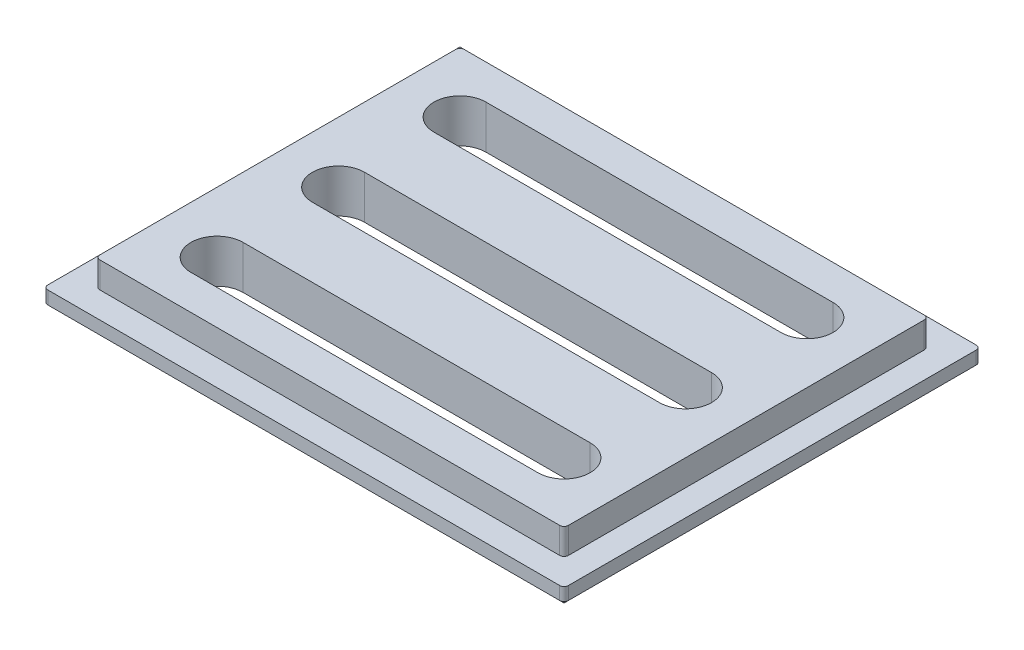
ISO-10303-21;
HEADER;
FILE_DESCRIPTION(('STEP AP214'),'2;1');
FILE_NAME('part.step','',(''),(''),'','','');
FILE_SCHEMA(('AUTOMOTIVE_DESIGN { 1 0 10303 214 1 1 1 1 }'));
ENDSEC;
DATA;
#1=APPLICATION_CONTEXT('core data for automotive mechanical design processes');
#2=APPLICATION_PROTOCOL_DEFINITION('international standard','automotive_design',2000,#1);
#3=PRODUCT_CONTEXT('',#1,'mechanical');
#4=PRODUCT('Part','Part','',(#3));
#5=PRODUCT_RELATED_PRODUCT_CATEGORY('part','',(#4));
#6=PRODUCT_DEFINITION_FORMATION('','',#4);
#7=PRODUCT_DEFINITION_CONTEXT('part definition',#1,'design');
#8=PRODUCT_DEFINITION('design','',#6,#7);
#9=PRODUCT_DEFINITION_SHAPE('','',#8);
#10=(LENGTH_UNIT() NAMED_UNIT(*) SI_UNIT(.MILLI.,.METRE.));
#11=(NAMED_UNIT(*) PLANE_ANGLE_UNIT() SI_UNIT($,.RADIAN.));
#12=(NAMED_UNIT(*) SI_UNIT($,.STERADIAN.) SOLID_ANGLE_UNIT());
#13=UNCERTAINTY_MEASURE_WITH_UNIT(LENGTH_MEASURE(1.E-05),#10,'distance_accuracy_value','');
#14=(GEOMETRIC_REPRESENTATION_CONTEXT(3) GLOBAL_UNCERTAINTY_ASSIGNED_CONTEXT((#13)) GLOBAL_UNIT_ASSIGNED_CONTEXT((#10,
#11,#12)) REPRESENTATION_CONTEXT('',''));
#15=CARTESIAN_POINT('',(0.,0.,0.));
#16=DIRECTION('',(0.,0.,1.));
#17=DIRECTION('',(1.,0.,0.));
#18=AXIS2_PLACEMENT_3D('',#15,#16,#17);
#19=CARTESIAN_POINT('',(-30.,2.,24.));
#20=DIRECTION('',(1.,0.,0.));
#21=DIRECTION('',(0.,0.,-1.));
#22=AXIS2_PLACEMENT_3D('',#19,#20,#21);
#23=PLANE('',#22);
#24=DIRECTION('',(0.,-1.,0.));
#25=VECTOR('',#24,1.);
#26=CARTESIAN_POINT('',(-30.,2.,-24.));
#27=LINE('',#26,#25);
#28=CARTESIAN_POINT('',(-30.,2.,-24.));
#29=VERTEX_POINT('',#28);
#30=CARTESIAN_POINT('',(-30.,0.499999999999994,-24.));
#31=VERTEX_POINT('',#30);
#32=EDGE_CURVE('E378',#29,#31,#27,.T.);
#33=ORIENTED_EDGE('',*,*,#32,.T.);
#34=DIRECTION('',(0.,0.,1.));
#35=VECTOR('',#34,1.);
#36=CARTESIAN_POINT('',(-30.,0.499999999999994,24.));
#37=LINE('',#36,#35);
#38=CARTESIAN_POINT('',(-30.,0.500000000000007,23.5));
#39=VERTEX_POINT('',#38);
#40=EDGE_CURVE('E451',#31,#39,#37,.T.);
#41=ORIENTED_EDGE('',*,*,#40,.T.);
#42=DIRECTION('',(0.,-1.,0.));
#43=VECTOR('',#42,1.);
#44=CARTESIAN_POINT('',(-30.,2.,23.5));
#45=LINE('',#44,#43);
#46=CARTESIAN_POINT('',(-30.,2.,23.5));
#47=VERTEX_POINT('',#46);
#48=EDGE_CURVE('E385',#39,#47,#45,.F.);
#49=ORIENTED_EDGE('',*,*,#48,.T.);
#50=DIRECTION('',(0.,0.,1.));
#51=VECTOR('',#50,1.);
#52=CARTESIAN_POINT('',(-30.,2.,24.));
#53=LINE('',#52,#51);
#54=EDGE_CURVE('E357',#29,#47,#53,.T.);
#55=ORIENTED_EDGE('',*,*,#54,.F.);
#56=EDGE_LOOP('',(#33,#41,#49,#55));
#57=FACE_BOUND('',#56,.T.);
#58=ADVANCED_FACE('F41',(#57),#23,.F.);
#59=CARTESIAN_POINT('',(30.,2.,24.));
#60=DIRECTION('',(0.,0.,-1.));
#61=DIRECTION('',(-1.,0.,0.));
#62=AXIS2_PLACEMENT_3D('',#59,#60,#61);
#63=PLANE('',#62);
#64=DIRECTION('',(0.,-1.,0.));
#65=VECTOR('',#64,1.);
#66=CARTESIAN_POINT('',(-29.5,2.,24.));
#67=LINE('',#66,#65);
#68=CARTESIAN_POINT('',(-29.5,2.,24.));
#69=VERTEX_POINT('',#68);
#70=CARTESIAN_POINT('',(-29.5,0.500000000000007,24.));
#71=VERTEX_POINT('',#70);
#72=EDGE_CURVE('E383',#69,#71,#67,.T.);
#73=ORIENTED_EDGE('',*,*,#72,.T.);
#74=DIRECTION('',(1.,0.,0.));
#75=VECTOR('',#74,1.);
#76=CARTESIAN_POINT('',(30.,0.500000000000007,24.));
#77=LINE('',#76,#75);
#78=CARTESIAN_POINT('',(29.5,0.500000000000007,24.));
#79=VERTEX_POINT('',#78);
#80=EDGE_CURVE('E11',#71,#79,#77,.T.);
#81=ORIENTED_EDGE('',*,*,#80,.T.);
#82=DIRECTION('',(0.,-1.,0.));
#83=VECTOR('',#82,1.);
#84=CARTESIAN_POINT('',(29.5,2.,24.));
#85=LINE('',#84,#83);
#86=CARTESIAN_POINT('',(29.5,2.,24.));
#87=VERTEX_POINT('',#86);
#88=EDGE_CURVE('E381',#79,#87,#85,.F.);
#89=ORIENTED_EDGE('',*,*,#88,.T.);
#90=DIRECTION('',(1.,0.,0.));
#91=VECTOR('',#90,1.);
#92=CARTESIAN_POINT('',(30.,2.,24.));
#93=LINE('',#92,#91);
#94=EDGE_CURVE('E370',#69,#87,#93,.T.);
#95=ORIENTED_EDGE('',*,*,#94,.F.);
#96=EDGE_LOOP('',(#73,#81,#89,#95));
#97=FACE_BOUND('',#96,.T.);
#98=ADVANCED_FACE('F558',(#97),#63,.F.);
#99=CARTESIAN_POINT('',(30.,2.,24.));
#100=DIRECTION('',(-1.,0.,0.));
#101=DIRECTION('',(0.,0.,1.));
#102=AXIS2_PLACEMENT_3D('',#99,#100,#101);
#103=PLANE('',#102);
#104=DIRECTION('',(0.,-1.,0.));
#105=VECTOR('',#104,1.);
#106=CARTESIAN_POINT('',(30.,2.,23.5));
#107=LINE('',#106,#105);
#108=CARTESIAN_POINT('',(30.,2.,23.5));
#109=VERTEX_POINT('',#108);
#110=CARTESIAN_POINT('',(30.,0.500000000000007,23.5));
#111=VERTEX_POINT('',#110);
#112=EDGE_CURVE('E395',#109,#111,#107,.T.);
#113=ORIENTED_EDGE('',*,*,#112,.T.);
#114=DIRECTION('',(0.,0.,-1.));
#115=VECTOR('',#114,1.);
#116=CARTESIAN_POINT('',(30.,0.499999999999994,24.));
#117=LINE('',#116,#115);
#118=CARTESIAN_POINT('',(30.,0.500000000000007,-23.5));
#119=VERTEX_POINT('',#118);
#120=EDGE_CURVE('E437',#111,#119,#117,.T.);
#121=ORIENTED_EDGE('',*,*,#120,.T.);
#122=DIRECTION('',(0.,-1.,0.));
#123=VECTOR('',#122,1.);
#124=CARTESIAN_POINT('',(30.,2.,-23.5));
#125=LINE('',#124,#123);
#126=CARTESIAN_POINT('',(30.,2.,-23.5));
#127=VERTEX_POINT('',#126);
#128=EDGE_CURVE('E393',#119,#127,#125,.F.);
#129=ORIENTED_EDGE('',*,*,#128,.T.);
#130=DIRECTION('',(0.,0.,-1.));
#131=VECTOR('',#130,1.);
#132=CARTESIAN_POINT('',(30.,2.,24.));
#133=LINE('',#132,#131);
#134=EDGE_CURVE('E373',#109,#127,#133,.T.);
#135=ORIENTED_EDGE('',*,*,#134,.F.);
#136=EDGE_LOOP('',(#113,#121,#129,#135));
#137=FACE_BOUND('',#136,.T.);
#138=ADVANCED_FACE('F495',(#137),#103,.F.);
#139=CARTESIAN_POINT('',(30.,2.,-24.));
#140=DIRECTION('',(0.,0.,1.));
#141=DIRECTION('',(1.,0.,0.));
#142=AXIS2_PLACEMENT_3D('',#139,#140,#141);
#143=PLANE('',#142);
#144=DIRECTION('',(0.,-1.,0.));
#145=VECTOR('',#144,1.);
#146=CARTESIAN_POINT('',(29.5,2.,-24.));
#147=LINE('',#146,#145);
#148=CARTESIAN_POINT('',(29.5,2.,-24.));
#149=VERTEX_POINT('',#148);
#150=CARTESIAN_POINT('',(29.5,0.500000000000007,-24.));
#151=VERTEX_POINT('',#150);
#152=EDGE_CURVE('E398',#149,#151,#147,.T.);
#153=ORIENTED_EDGE('',*,*,#152,.T.);
#154=DIRECTION('',(-1.,0.,0.));
#155=VECTOR('',#154,1.);
#156=CARTESIAN_POINT('',(30.,0.499999999999994,-24.));
#157=LINE('',#156,#155);
#158=EDGE_CURVE('E449',#151,#31,#157,.T.);
#159=ORIENTED_EDGE('',*,*,#158,.T.);
#160=ORIENTED_EDGE('',*,*,#32,.F.);
#161=DIRECTION('',(-1.,0.,0.));
#162=VECTOR('',#161,1.);
#163=CARTESIAN_POINT('',(30.,2.,-24.));
#164=LINE('',#163,#162);
#165=EDGE_CURVE('E376',#149,#29,#164,.T.);
#166=ORIENTED_EDGE('',*,*,#165,.F.);
#167=EDGE_LOOP('',(#153,#159,#160,#166));
#168=FACE_BOUND('',#167,.T.);
#169=ADVANCED_FACE('F507',(#168),#143,.F.);
#170=CARTESIAN_POINT('',(0.,2.,0.));
#171=DIRECTION('',(0.,1.,0.));
#172=DIRECTION('',(0.,0.,1.));
#173=AXIS2_PLACEMENT_3D('',#170,#171,#172);
#174=PLANE('',#173);
#175=DIRECTION('',(0.,0.,1.));
#176=VECTOR('',#175,1.);
#177=CARTESIAN_POINT('',(-27.,2.,21.));
#178=LINE('',#177,#176);
#179=CARTESIAN_POINT('',(-27.,2.,-20.5));
#180=VERTEX_POINT('',#179);
#181=CARTESIAN_POINT('',(-27.,2.,20.5));
#182=VERTEX_POINT('',#181);
#183=EDGE_CURVE('E343',#180,#182,#178,.T.);
#184=ORIENTED_EDGE('',*,*,#183,.F.);
#185=CARTESIAN_POINT('',(-26.5,2.,-20.5));
#186=DIRECTION('',(0.,1.,0.));
#187=DIRECTION('',(0.,0.,1.));
#188=AXIS2_PLACEMENT_3D('',#185,#186,#187);
#189=CIRCLE('',#188,0.5);
#190=CARTESIAN_POINT('',(-26.5,2.,-21.));
#191=VERTEX_POINT('',#190);
#192=EDGE_CURVE('E431',#180,#191,#189,.F.);
#193=ORIENTED_EDGE('',*,*,#192,.T.);
#194=DIRECTION('',(-1.,0.,0.));
#195=VECTOR('',#194,1.);
#196=CARTESIAN_POINT('',(27.,2.,-21.));
#197=LINE('',#196,#195);
#198=CARTESIAN_POINT('',(26.5,2.,-21.));
#199=VERTEX_POINT('',#198);
#200=EDGE_CURVE('E348',#199,#191,#197,.T.);
#201=ORIENTED_EDGE('',*,*,#200,.F.);
#202=CARTESIAN_POINT('',(26.5,2.,-20.5));
#203=DIRECTION('',(0.,1.,0.));
#204=DIRECTION('',(0.,0.,1.));
#205=AXIS2_PLACEMENT_3D('',#202,#203,#204);
#206=CIRCLE('',#205,0.5);
#207=CARTESIAN_POINT('',(27.,2.,-20.5));
#208=VERTEX_POINT('',#207);
#209=EDGE_CURVE('E429',#199,#208,#206,.F.);
#210=ORIENTED_EDGE('',*,*,#209,.T.);
#211=DIRECTION('',(0.,0.,-1.));
#212=VECTOR('',#211,1.);
#213=CARTESIAN_POINT('',(27.,2.,21.));
#214=LINE('',#213,#212);
#215=CARTESIAN_POINT('',(27.,2.,20.5));
#216=VERTEX_POINT('',#215);
#217=EDGE_CURVE('E363',#216,#208,#214,.T.);
#218=ORIENTED_EDGE('',*,*,#217,.F.);
#219=CARTESIAN_POINT('',(26.5,2.,20.5));
#220=DIRECTION('',(0.,1.,0.));
#221=DIRECTION('',(0.,0.,1.));
#222=AXIS2_PLACEMENT_3D('',#219,#220,#221);
#223=CIRCLE('',#222,0.5);
#224=CARTESIAN_POINT('',(26.5,2.,21.));
#225=VERTEX_POINT('',#224);
#226=EDGE_CURVE('E433',#216,#225,#223,.F.);
#227=ORIENTED_EDGE('',*,*,#226,.T.);
#228=DIRECTION('',(1.,0.,0.));
#229=VECTOR('',#228,1.);
#230=CARTESIAN_POINT('',(27.,2.,21.));
#231=LINE('',#230,#229);
#232=CARTESIAN_POINT('',(-26.5,2.,21.));
#233=VERTEX_POINT('',#232);
#234=EDGE_CURVE('E360',#233,#225,#231,.T.);
#235=ORIENTED_EDGE('',*,*,#234,.F.);
#236=CARTESIAN_POINT('',(-26.5,2.,20.5));
#237=DIRECTION('',(0.,1.,0.));
#238=DIRECTION('',(0.,0.,1.));
#239=AXIS2_PLACEMENT_3D('',#236,#237,#238);
#240=CIRCLE('',#239,0.5);
#241=EDGE_CURVE('E435',#233,#182,#240,.F.);
#242=ORIENTED_EDGE('',*,*,#241,.T.);
#243=EDGE_LOOP('',(#184,#193,#201,#210,#218,#227,#235,#242));
#244=FACE_BOUND('',#243,.T.);
#245=ORIENTED_EDGE('',*,*,#54,.T.);
#246=CARTESIAN_POINT('',(-29.5,2.,23.5));
#247=DIRECTION('',(0.,1.,0.));
#248=DIRECTION('',(0.,0.,1.));
#249=AXIS2_PLACEMENT_3D('',#246,#247,#248);
#250=CIRCLE('',#249,0.5);
#251=EDGE_CURVE('E391',#47,#69,#250,.T.);
#252=ORIENTED_EDGE('',*,*,#251,.T.);
#253=ORIENTED_EDGE('',*,*,#94,.T.);
#254=CARTESIAN_POINT('',(29.5,2.,23.5));
#255=DIRECTION('',(0.,1.,0.));
#256=DIRECTION('',(0.,0.,1.));
#257=AXIS2_PLACEMENT_3D('',#254,#255,#256);
#258=CIRCLE('',#257,0.5);
#259=EDGE_CURVE('E389',#87,#109,#258,.T.);
#260=ORIENTED_EDGE('',*,*,#259,.T.);
#261=ORIENTED_EDGE('',*,*,#134,.T.);
#262=CARTESIAN_POINT('',(29.5,2.,-23.5));
#263=DIRECTION('',(0.,1.,0.));
#264=DIRECTION('',(0.,0.,1.));
#265=AXIS2_PLACEMENT_3D('',#262,#263,#264);
#266=CIRCLE('',#265,0.5);
#267=EDGE_CURVE('E387',#127,#149,#266,.T.);
#268=ORIENTED_EDGE('',*,*,#267,.T.);
#269=ORIENTED_EDGE('',*,*,#165,.T.);
#270=EDGE_LOOP('',(#245,#252,#253,#260,#261,#268,#269));
#271=FACE_BOUND('',#270,.T.);
#272=ADVANCED_FACE('F499',(#244,#271),#174,.T.);
#273=CARTESIAN_POINT('',(0.,0.,0.));
#274=DIRECTION('',(0.,1.,0.));
#275=DIRECTION('',(0.,0.,1.));
#276=AXIS2_PLACEMENT_3D('',#273,#274,#275);
#277=PLANE('',#276);
#278=DIRECTION('',(1.,0.,0.));
#279=VECTOR('',#278,1.);
#280=CARTESIAN_POINT('',(0.,0.,-23.5));
#281=LINE('',#280,#279);
#282=CARTESIAN_POINT('',(-29.5,0.,-23.5));
#283=VERTEX_POINT('',#282);
#284=CARTESIAN_POINT('',(29.5,0.,-23.5));
#285=VERTEX_POINT('',#284);
#286=EDGE_CURVE('E444',#283,#285,#281,.T.);
#287=ORIENTED_EDGE('',*,*,#286,.T.);
#288=DIRECTION('',(0.,0.,1.));
#289=VECTOR('',#288,1.);
#290=CARTESIAN_POINT('',(29.5,0.,0.));
#291=LINE('',#290,#289);
#292=CARTESIAN_POINT('',(29.5,0.,23.5));
#293=VERTEX_POINT('',#292);
#294=EDGE_CURVE('E446',#285,#293,#291,.T.);
#295=ORIENTED_EDGE('',*,*,#294,.T.);
#296=DIRECTION('',(-1.,0.,0.));
#297=VECTOR('',#296,1.);
#298=CARTESIAN_POINT('',(0.,0.,23.5));
#299=LINE('',#298,#297);
#300=CARTESIAN_POINT('',(-29.5,0.,23.5));
#301=VERTEX_POINT('',#300);
#302=EDGE_CURVE('E440',#293,#301,#299,.T.);
#303=ORIENTED_EDGE('',*,*,#302,.T.);
#304=DIRECTION('',(0.,0.,-1.));
#305=VECTOR('',#304,1.);
#306=CARTESIAN_POINT('',(-29.5,0.,0.));
#307=LINE('',#306,#305);
#308=EDGE_CURVE('E442',#301,#283,#307,.T.);
#309=ORIENTED_EDGE('',*,*,#308,.T.);
#310=EDGE_LOOP('',(#287,#295,#303,#309));
#311=FACE_BOUND('',#310,.T.);
#312=DIRECTION('',(1.,0.,0.));
#313=VECTOR('',#312,1.);
#314=CARTESIAN_POINT('',(0.,0.,-11.));
#315=LINE('',#314,#313);
#316=CARTESIAN_POINT('',(-20.,0.,-11.));
#317=VERTEX_POINT('',#316);
#318=CARTESIAN_POINT('',(20.,0.,-11.));
#319=VERTEX_POINT('',#318);
#320=EDGE_CURVE('E337',#317,#319,#315,.T.);
#321=ORIENTED_EDGE('',*,*,#320,.T.);
#322=CARTESIAN_POINT('',(20.,0.,-14.));
#323=DIRECTION('',(0.,1.,0.));
#324=DIRECTION('',(0.,0.,1.));
#325=AXIS2_PLACEMENT_3D('',#322,#323,#324);
#326=CIRCLE('',#325,3.);
#327=CARTESIAN_POINT('',(20.,0.,-17.));
#328=VERTEX_POINT('',#327);
#329=EDGE_CURVE('E340',#319,#328,#326,.T.);
#330=ORIENTED_EDGE('',*,*,#329,.T.);
#331=DIRECTION('',(-1.,0.,0.));
#332=VECTOR('',#331,1.);
#333=CARTESIAN_POINT('',(0.,0.,-17.));
#334=LINE('',#333,#332);
#335=CARTESIAN_POINT('',(-20.,0.,-17.));
#336=VERTEX_POINT('',#335);
#337=EDGE_CURVE('E334',#328,#336,#334,.T.);
#338=ORIENTED_EDGE('',*,*,#337,.T.);
#339=CARTESIAN_POINT('',(-20.,0.,-14.));
#340=DIRECTION('',(0.,1.,0.));
#341=DIRECTION('',(0.,0.,1.));
#342=AXIS2_PLACEMENT_3D('',#339,#340,#341);
#343=CIRCLE('',#342,3.);
#344=EDGE_CURVE('E243',#336,#317,#343,.T.);
#345=ORIENTED_EDGE('',*,*,#344,.T.);
#346=EDGE_LOOP('',(#321,#330,#338,#345));
#347=FACE_BOUND('',#346,.T.);
#348=DIRECTION('',(1.,0.,0.));
#349=VECTOR('',#348,1.);
#350=CARTESIAN_POINT('',(0.,0.,3.));
#351=LINE('',#350,#349);
#352=CARTESIAN_POINT('',(-20.,0.,3.));
#353=VERTEX_POINT('',#352);
#354=CARTESIAN_POINT('',(20.,0.,3.));
#355=VERTEX_POINT('',#354);
#356=EDGE_CURVE('E328',#353,#355,#351,.T.);
#357=ORIENTED_EDGE('',*,*,#356,.T.);
#358=CARTESIAN_POINT('',(20.,0.,0.));
#359=DIRECTION('',(0.,1.,0.));
#360=DIRECTION('',(0.,0.,1.));
#361=AXIS2_PLACEMENT_3D('',#358,#359,#360);
#362=CIRCLE('',#361,3.);
#363=CARTESIAN_POINT('',(20.,0.,-3.));
#364=VERTEX_POINT('',#363);
#365=EDGE_CURVE('E331',#355,#364,#362,.T.);
#366=ORIENTED_EDGE('',*,*,#365,.T.);
#367=DIRECTION('',(-1.,0.,0.));
#368=VECTOR('',#367,1.);
#369=CARTESIAN_POINT('',(0.,0.,-3.));
#370=LINE('',#369,#368);
#371=CARTESIAN_POINT('',(-20.,0.,-3.));
#372=VERTEX_POINT('',#371);
#373=EDGE_CURVE('E322',#364,#372,#370,.T.);
#374=ORIENTED_EDGE('',*,*,#373,.T.);
#375=CARTESIAN_POINT('',(-20.,0.,0.));
#376=DIRECTION('',(0.,1.,0.));
#377=DIRECTION('',(0.,0.,1.));
#378=AXIS2_PLACEMENT_3D('',#375,#376,#377);
#379=CIRCLE('',#378,3.);
#380=EDGE_CURVE('E325',#372,#353,#379,.T.);
#381=ORIENTED_EDGE('',*,*,#380,.T.);
#382=EDGE_LOOP('',(#357,#366,#374,#381));
#383=FACE_BOUND('',#382,.T.);
#384=DIRECTION('',(1.,0.,0.));
#385=VECTOR('',#384,1.);
#386=CARTESIAN_POINT('',(0.,0.,17.));
#387=LINE('',#386,#385);
#388=CARTESIAN_POINT('',(-20.,0.,17.));
#389=VERTEX_POINT('',#388);
#390=CARTESIAN_POINT('',(20.,0.,17.));
#391=VERTEX_POINT('',#390);
#392=EDGE_CURVE('E316',#389,#391,#387,.T.);
#393=ORIENTED_EDGE('',*,*,#392,.T.);
#394=CARTESIAN_POINT('',(20.,0.,14.));
#395=DIRECTION('',(0.,1.,0.));
#396=DIRECTION('',(0.,0.,1.));
#397=AXIS2_PLACEMENT_3D('',#394,#395,#396);
#398=CIRCLE('',#397,3.);
#399=CARTESIAN_POINT('',(20.,0.,11.));
#400=VERTEX_POINT('',#399);
#401=EDGE_CURVE('E319',#391,#400,#398,.T.);
#402=ORIENTED_EDGE('',*,*,#401,.T.);
#403=DIRECTION('',(-1.,0.,0.));
#404=VECTOR('',#403,1.);
#405=CARTESIAN_POINT('',(0.,0.,11.));
#406=LINE('',#405,#404);
#407=CARTESIAN_POINT('',(-20.,0.,11.));
#408=VERTEX_POINT('',#407);
#409=EDGE_CURVE('E268',#400,#408,#406,.T.);
#410=ORIENTED_EDGE('',*,*,#409,.T.);
#411=CARTESIAN_POINT('',(-20.,0.,14.));
#412=DIRECTION('',(0.,1.,0.));
#413=DIRECTION('',(0.,0.,1.));
#414=AXIS2_PLACEMENT_3D('',#411,#412,#413);
#415=CIRCLE('',#414,3.);
#416=EDGE_CURVE('E313',#408,#389,#415,.T.);
#417=ORIENTED_EDGE('',*,*,#416,.T.);
#418=EDGE_LOOP('',(#393,#402,#410,#417));
#419=FACE_BOUND('',#418,.T.);
#420=ADVANCED_FACE('F520',(#311,#347,#383,#419),#277,.F.);
#421=CARTESIAN_POINT('',(-27.,5.,21.));
#422=DIRECTION('',(1.,0.,0.));
#423=DIRECTION('',(0.,0.,-1.));
#424=AXIS2_PLACEMENT_3D('',#421,#422,#423);
#425=PLANE('',#424);
#426=DIRECTION('',(0.,0.,1.));
#427=VECTOR('',#426,1.);
#428=CARTESIAN_POINT('',(-27.,5.,21.));
#429=LINE('',#428,#427);
#430=CARTESIAN_POINT('',(-27.,5.,-20.5));
#431=VERTEX_POINT('',#430);
#432=CARTESIAN_POINT('',(-27.,5.,20.5));
#433=VERTEX_POINT('',#432);
#434=EDGE_CURVE('E344',#431,#433,#429,.T.);
#435=ORIENTED_EDGE('',*,*,#434,.F.);
#436=DIRECTION('',(0.,-1.,0.));
#437=VECTOR('',#436,1.);
#438=CARTESIAN_POINT('',(-27.,5.,-20.5));
#439=LINE('',#438,#437);
#440=EDGE_CURVE('E421',#431,#180,#439,.T.);
#441=ORIENTED_EDGE('',*,*,#440,.T.);
#442=ORIENTED_EDGE('',*,*,#183,.T.);
#443=DIRECTION('',(0.,-1.,0.));
#444=VECTOR('',#443,1.);
#445=CARTESIAN_POINT('',(-27.,5.,20.5));
#446=LINE('',#445,#444);
#447=EDGE_CURVE('E419',#182,#433,#446,.F.);
#448=ORIENTED_EDGE('',*,*,#447,.T.);
#449=EDGE_LOOP('',(#435,#441,#442,#448));
#450=FACE_BOUND('',#449,.T.);
#451=ADVANCED_FACE('F523',(#450),#425,.F.);
#452=CARTESIAN_POINT('',(27.,5.,21.));
#453=DIRECTION('',(0.,0.,-1.));
#454=DIRECTION('',(-1.,0.,0.));
#455=AXIS2_PLACEMENT_3D('',#452,#453,#454);
#456=PLANE('',#455);
#457=ORIENTED_EDGE('',*,*,#234,.T.);
#458=DIRECTION('',(0.,-1.,0.));
#459=VECTOR('',#458,1.);
#460=CARTESIAN_POINT('',(26.5,5.,21.));
#461=LINE('',#460,#459);
#462=CARTESIAN_POINT('',(26.5,5.,21.));
#463=VERTEX_POINT('',#462);
#464=EDGE_CURVE('E427',#225,#463,#461,.F.);
#465=ORIENTED_EDGE('',*,*,#464,.T.);
#466=DIRECTION('',(1.,0.,0.));
#467=VECTOR('',#466,1.);
#468=CARTESIAN_POINT('',(27.,5.,21.));
#469=LINE('',#468,#467);
#470=CARTESIAN_POINT('',(-26.5,5.,21.));
#471=VERTEX_POINT('',#470);
#472=EDGE_CURVE('E347',#471,#463,#469,.T.);
#473=ORIENTED_EDGE('',*,*,#472,.F.);
#474=DIRECTION('',(0.,-1.,0.));
#475=VECTOR('',#474,1.);
#476=CARTESIAN_POINT('',(-26.5,5.,21.));
#477=LINE('',#476,#475);
#478=EDGE_CURVE('E424',#471,#233,#477,.T.);
#479=ORIENTED_EDGE('',*,*,#478,.T.);
#480=EDGE_LOOP('',(#457,#465,#473,#479));
#481=FACE_BOUND('',#480,.T.);
#482=ADVANCED_FACE('F688',(#481),#456,.F.);
#483=CARTESIAN_POINT('',(27.,5.,21.));
#484=DIRECTION('',(-1.,0.,0.));
#485=DIRECTION('',(0.,0.,1.));
#486=AXIS2_PLACEMENT_3D('',#483,#484,#485);
#487=PLANE('',#486);
#488=ORIENTED_EDGE('',*,*,#217,.T.);
#489=DIRECTION('',(0.,-1.,0.));
#490=VECTOR('',#489,1.);
#491=CARTESIAN_POINT('',(27.,5.,-20.5));
#492=LINE('',#491,#490);
#493=CARTESIAN_POINT('',(27.,5.,-20.5));
#494=VERTEX_POINT('',#493);
#495=EDGE_CURVE('E409',#208,#494,#492,.F.);
#496=ORIENTED_EDGE('',*,*,#495,.T.);
#497=DIRECTION('',(0.,0.,-1.));
#498=VECTOR('',#497,1.);
#499=CARTESIAN_POINT('',(27.,5.,21.));
#500=LINE('',#499,#498);
#501=CARTESIAN_POINT('',(27.,5.,20.5));
#502=VERTEX_POINT('',#501);
#503=EDGE_CURVE('E351',#502,#494,#500,.T.);
#504=ORIENTED_EDGE('',*,*,#503,.F.);
#505=DIRECTION('',(0.,-1.,0.));
#506=VECTOR('',#505,1.);
#507=CARTESIAN_POINT('',(27.,5.,20.5));
#508=LINE('',#507,#506);
#509=EDGE_CURVE('E406',#502,#216,#508,.T.);
#510=ORIENTED_EDGE('',*,*,#509,.T.);
#511=EDGE_LOOP('',(#488,#496,#504,#510));
#512=FACE_BOUND('',#511,.T.);
#513=ADVANCED_FACE('F697',(#512),#487,.F.);
#514=CARTESIAN_POINT('',(27.,5.,-21.));
#515=DIRECTION('',(0.,0.,1.));
#516=DIRECTION('',(1.,0.,0.));
#517=AXIS2_PLACEMENT_3D('',#514,#515,#516);
#518=PLANE('',#517);
#519=DIRECTION('',(-1.,0.,0.));
#520=VECTOR('',#519,1.);
#521=CARTESIAN_POINT('',(27.,5.,-21.));
#522=LINE('',#521,#520);
#523=CARTESIAN_POINT('',(26.5,5.,-21.));
#524=VERTEX_POINT('',#523);
#525=CARTESIAN_POINT('',(-26.5,5.,-21.));
#526=VERTEX_POINT('',#525);
#527=EDGE_CURVE('E354',#524,#526,#522,.T.);
#528=ORIENTED_EDGE('',*,*,#527,.F.);
#529=DIRECTION('',(0.,-1.,0.));
#530=VECTOR('',#529,1.);
#531=CARTESIAN_POINT('',(26.5,5.,-21.));
#532=LINE('',#531,#530);
#533=EDGE_CURVE('E403',#524,#199,#532,.T.);
#534=ORIENTED_EDGE('',*,*,#533,.T.);
#535=ORIENTED_EDGE('',*,*,#200,.T.);
#536=DIRECTION('',(0.,-1.,0.));
#537=VECTOR('',#536,1.);
#538=CARTESIAN_POINT('',(-26.5,5.,-21.));
#539=LINE('',#538,#537);
#540=EDGE_CURVE('E401',#191,#526,#539,.F.);
#541=ORIENTED_EDGE('',*,*,#540,.T.);
#542=EDGE_LOOP('',(#528,#534,#535,#541));
#543=FACE_BOUND('',#542,.T.);
#544=ADVANCED_FACE('F706',(#543),#518,.F.);
#545=CARTESIAN_POINT('',(0.,5.,0.));
#546=DIRECTION('',(0.,1.,0.));
#547=DIRECTION('',(0.,0.,1.));
#548=AXIS2_PLACEMENT_3D('',#545,#546,#547);
#549=PLANE('',#548);
#550=CARTESIAN_POINT('',(20.,5.,-14.));
#551=DIRECTION('',(0.,1.,0.));
#552=DIRECTION('',(0.,0.,1.));
#553=AXIS2_PLACEMENT_3D('',#550,#551,#552);
#554=CIRCLE('',#553,3.);
#555=CARTESIAN_POINT('',(20.,5.,-11.));
#556=VERTEX_POINT('',#555);
#557=CARTESIAN_POINT('',(20.,5.,-17.));
#558=VERTEX_POINT('',#557);
#559=EDGE_CURVE('E256',#556,#558,#554,.T.);
#560=ORIENTED_EDGE('',*,*,#559,.F.);
#561=DIRECTION('',(1.,0.,0.));
#562=VECTOR('',#561,1.);
#563=CARTESIAN_POINT('',(-20.,5.,-11.));
#564=LINE('',#563,#562);
#565=CARTESIAN_POINT('',(-20.,5.,-11.));
#566=VERTEX_POINT('',#565);
#567=EDGE_CURVE('E261',#566,#556,#564,.T.);
#568=ORIENTED_EDGE('',*,*,#567,.F.);
#569=CARTESIAN_POINT('',(-20.,5.,-14.));
#570=DIRECTION('',(0.,1.,0.));
#571=DIRECTION('',(0.,0.,1.));
#572=AXIS2_PLACEMENT_3D('',#569,#570,#571);
#573=CIRCLE('',#572,3.);
#574=CARTESIAN_POINT('',(-20.,5.,-17.));
#575=VERTEX_POINT('',#574);
#576=EDGE_CURVE('E240',#575,#566,#573,.T.);
#577=ORIENTED_EDGE('',*,*,#576,.F.);
#578=DIRECTION('',(-1.,0.,0.));
#579=VECTOR('',#578,1.);
#580=CARTESIAN_POINT('',(-20.,5.,-17.));
#581=LINE('',#580,#579);
#582=EDGE_CURVE('E251',#558,#575,#581,.T.);
#583=ORIENTED_EDGE('',*,*,#582,.F.);
#584=EDGE_LOOP('',(#560,#568,#577,#583));
#585=FACE_BOUND('',#584,.T.);
#586=CARTESIAN_POINT('',(20.,5.,0.));
#587=DIRECTION('',(0.,1.,0.));
#588=DIRECTION('',(0.,0.,1.));
#589=AXIS2_PLACEMENT_3D('',#586,#587,#588);
#590=CIRCLE('',#589,3.);
#591=CARTESIAN_POINT('',(20.,5.,3.));
#592=VERTEX_POINT('',#591);
#593=CARTESIAN_POINT('',(20.,5.,-3.));
#594=VERTEX_POINT('',#593);
#595=EDGE_CURVE('E290',#592,#594,#590,.T.);
#596=ORIENTED_EDGE('',*,*,#595,.F.);
#597=DIRECTION('',(1.,0.,0.));
#598=VECTOR('',#597,1.);
#599=CARTESIAN_POINT('',(-20.,5.,3.00000000000001));
#600=LINE('',#599,#598);
#601=CARTESIAN_POINT('',(-20.,5.,3.));
#602=VERTEX_POINT('',#601);
#603=EDGE_CURVE('E274',#602,#592,#600,.T.);
#604=ORIENTED_EDGE('',*,*,#603,.F.);
#605=CARTESIAN_POINT('',(-20.,5.,0.));
#606=DIRECTION('',(0.,1.,0.));
#607=DIRECTION('',(0.,0.,1.));
#608=AXIS2_PLACEMENT_3D('',#605,#606,#607);
#609=CIRCLE('',#608,3.);
#610=CARTESIAN_POINT('',(-20.,5.,-3.));
#611=VERTEX_POINT('',#610);
#612=EDGE_CURVE('E284',#611,#602,#609,.T.);
#613=ORIENTED_EDGE('',*,*,#612,.F.);
#614=DIRECTION('',(-1.,0.,0.));
#615=VECTOR('',#614,1.);
#616=CARTESIAN_POINT('',(-20.,5.,-3.));
#617=LINE('',#616,#615);
#618=EDGE_CURVE('E287',#594,#611,#617,.T.);
#619=ORIENTED_EDGE('',*,*,#618,.F.);
#620=EDGE_LOOP('',(#596,#604,#613,#619));
#621=FACE_BOUND('',#620,.T.);
#622=CARTESIAN_POINT('',(20.,5.,14.));
#623=DIRECTION('',(0.,1.,0.));
#624=DIRECTION('',(0.,0.,1.));
#625=AXIS2_PLACEMENT_3D('',#622,#623,#624);
#626=CIRCLE('',#625,3.);
#627=CARTESIAN_POINT('',(20.,5.,17.));
#628=VERTEX_POINT('',#627);
#629=CARTESIAN_POINT('',(20.,5.,11.));
#630=VERTEX_POINT('',#629);
#631=EDGE_CURVE('E281',#628,#630,#626,.T.);
#632=ORIENTED_EDGE('',*,*,#631,.F.);
#633=DIRECTION('',(1.,0.,0.));
#634=VECTOR('',#633,1.);
#635=CARTESIAN_POINT('',(-20.,5.,17.));
#636=LINE('',#635,#634);
#637=CARTESIAN_POINT('',(-20.,5.,17.));
#638=VERTEX_POINT('',#637);
#639=EDGE_CURVE('E295',#638,#628,#636,.T.);
#640=ORIENTED_EDGE('',*,*,#639,.F.);
#641=CARTESIAN_POINT('',(-20.,5.,14.));
#642=DIRECTION('',(0.,1.,0.));
#643=DIRECTION('',(0.,0.,1.));
#644=AXIS2_PLACEMENT_3D('',#641,#642,#643);
#645=CIRCLE('',#644,3.);
#646=CARTESIAN_POINT('',(-20.,5.,11.));
#647=VERTEX_POINT('',#646);
#648=EDGE_CURVE('E304',#647,#638,#645,.T.);
#649=ORIENTED_EDGE('',*,*,#648,.F.);
#650=DIRECTION('',(-1.,0.,0.));
#651=VECTOR('',#650,1.);
#652=CARTESIAN_POINT('',(-20.,5.,11.));
#653=LINE('',#652,#651);
#654=EDGE_CURVE('E307',#630,#647,#653,.T.);
#655=ORIENTED_EDGE('',*,*,#654,.F.);
#656=EDGE_LOOP('',(#632,#640,#649,#655));
#657=FACE_BOUND('',#656,.T.);
#658=ORIENTED_EDGE('',*,*,#503,.T.);
#659=CARTESIAN_POINT('',(26.5,5.,-20.5));
#660=DIRECTION('',(0.,1.,0.));
#661=DIRECTION('',(0.,0.,1.));
#662=AXIS2_PLACEMENT_3D('',#659,#660,#661);
#663=CIRCLE('',#662,0.5);
#664=EDGE_CURVE('E417',#494,#524,#663,.T.);
#665=ORIENTED_EDGE('',*,*,#664,.T.);
#666=ORIENTED_EDGE('',*,*,#527,.T.);
#667=CARTESIAN_POINT('',(-26.5,5.,-20.5));
#668=DIRECTION('',(0.,1.,0.));
#669=DIRECTION('',(0.,0.,1.));
#670=AXIS2_PLACEMENT_3D('',#667,#668,#669);
#671=CIRCLE('',#670,0.5);
#672=EDGE_CURVE('E415',#526,#431,#671,.T.);
#673=ORIENTED_EDGE('',*,*,#672,.T.);
#674=ORIENTED_EDGE('',*,*,#434,.T.);
#675=CARTESIAN_POINT('',(-26.5,5.,20.5));
#676=DIRECTION('',(0.,1.,0.));
#677=DIRECTION('',(0.,0.,1.));
#678=AXIS2_PLACEMENT_3D('',#675,#676,#677);
#679=CIRCLE('',#678,0.5);
#680=EDGE_CURVE('E411',#433,#471,#679,.T.);
#681=ORIENTED_EDGE('',*,*,#680,.T.);
#682=ORIENTED_EDGE('',*,*,#472,.T.);
#683=CARTESIAN_POINT('',(26.5,5.,20.5));
#684=DIRECTION('',(0.,1.,0.));
#685=DIRECTION('',(0.,0.,1.));
#686=AXIS2_PLACEMENT_3D('',#683,#684,#685);
#687=CIRCLE('',#686,0.5);
#688=EDGE_CURVE('E413',#463,#502,#687,.T.);
#689=ORIENTED_EDGE('',*,*,#688,.T.);
#690=EDGE_LOOP('',(#658,#665,#666,#673,#674,#681,#682,#689));
#691=FACE_BOUND('',#690,.T.);
#692=ADVANCED_FACE('F258',(#585,#621,#657,#691),#549,.T.);
#693=CARTESIAN_POINT('',(20.,-45.,14.));
#694=DIRECTION('',(0.,1.,0.));
#695=DIRECTION('',(0.,0.,1.));
#696=AXIS2_PLACEMENT_3D('',#693,#694,#695);
#697=CYLINDRICAL_SURFACE('',#696,3.);
#698=DIRECTION('',(0.,1.,0.));
#699=VECTOR('',#698,1.);
#700=CARTESIAN_POINT('',(20.,-45.,17.));
#701=LINE('',#700,#699);
#702=EDGE_CURVE('E300',#391,#628,#701,.T.);
#703=ORIENTED_EDGE('',*,*,#702,.T.);
#704=ORIENTED_EDGE('',*,*,#631,.T.);
#705=DIRECTION('',(0.,1.,0.));
#706=VECTOR('',#705,1.);
#707=CARTESIAN_POINT('',(20.,-45.,11.));
#708=LINE('',#707,#706);
#709=EDGE_CURVE('E292',#400,#630,#708,.T.);
#710=ORIENTED_EDGE('',*,*,#709,.F.);
#711=ORIENTED_EDGE('',*,*,#401,.F.);
#712=EDGE_LOOP('',(#703,#704,#710,#711));
#713=FACE_BOUND('',#712,.T.);
#714=ADVANCED_FACE('F542',(#713),#697,.F.);
#715=CARTESIAN_POINT('',(-20.,-45.,17.));
#716=DIRECTION('',(0.,0.,1.));
#717=DIRECTION('',(1.,0.,0.));
#718=AXIS2_PLACEMENT_3D('',#715,#716,#717);
#719=PLANE('',#718);
#720=DIRECTION('',(0.,1.,0.));
#721=VECTOR('',#720,1.);
#722=CARTESIAN_POINT('',(-20.,-45.,17.));
#723=LINE('',#722,#721);
#724=EDGE_CURVE('E298',#389,#638,#723,.T.);
#725=ORIENTED_EDGE('',*,*,#724,.T.);
#726=ORIENTED_EDGE('',*,*,#639,.T.);
#727=ORIENTED_EDGE('',*,*,#702,.F.);
#728=ORIENTED_EDGE('',*,*,#392,.F.);
#729=EDGE_LOOP('',(#725,#726,#727,#728));
#730=FACE_BOUND('',#729,.T.);
#731=ADVANCED_FACE('F531',(#730),#719,.F.);
#732=CARTESIAN_POINT('',(-20.,-45.,14.));
#733=DIRECTION('',(0.,1.,0.));
#734=DIRECTION('',(0.,0.,1.));
#735=AXIS2_PLACEMENT_3D('',#732,#733,#734);
#736=CYLINDRICAL_SURFACE('',#735,3.);
#737=DIRECTION('',(0.,1.,0.));
#738=VECTOR('',#737,1.);
#739=CARTESIAN_POINT('',(-20.,-45.,11.));
#740=LINE('',#739,#738);
#741=EDGE_CURVE('E296',#408,#647,#740,.T.);
#742=ORIENTED_EDGE('',*,*,#741,.T.);
#743=ORIENTED_EDGE('',*,*,#648,.T.);
#744=ORIENTED_EDGE('',*,*,#724,.F.);
#745=ORIENTED_EDGE('',*,*,#416,.F.);
#746=EDGE_LOOP('',(#742,#743,#744,#745));
#747=FACE_BOUND('',#746,.T.);
#748=ADVANCED_FACE('F533',(#747),#736,.F.);
#749=CARTESIAN_POINT('',(-20.,-45.,11.));
#750=DIRECTION('',(0.,0.,-1.));
#751=DIRECTION('',(-1.,0.,0.));
#752=AXIS2_PLACEMENT_3D('',#749,#750,#751);
#753=PLANE('',#752);
#754=ORIENTED_EDGE('',*,*,#709,.T.);
#755=ORIENTED_EDGE('',*,*,#654,.T.);
#756=ORIENTED_EDGE('',*,*,#741,.F.);
#757=ORIENTED_EDGE('',*,*,#409,.F.);
#758=EDGE_LOOP('',(#754,#755,#756,#757));
#759=FACE_BOUND('',#758,.T.);
#760=ADVANCED_FACE('F544',(#759),#753,.F.);
#761=CARTESIAN_POINT('',(20.,-45.,0.));
#762=DIRECTION('',(0.,1.,0.));
#763=DIRECTION('',(0.,0.,1.));
#764=AXIS2_PLACEMENT_3D('',#761,#762,#763);
#765=CYLINDRICAL_SURFACE('',#764,3.);
#766=DIRECTION('',(0.,1.,0.));
#767=VECTOR('',#766,1.);
#768=CARTESIAN_POINT('',(20.,-45.,3.));
#769=LINE('',#768,#767);
#770=EDGE_CURVE('E279',#355,#592,#769,.T.);
#771=ORIENTED_EDGE('',*,*,#770,.T.);
#772=ORIENTED_EDGE('',*,*,#595,.T.);
#773=DIRECTION('',(0.,1.,0.));
#774=VECTOR('',#773,1.);
#775=CARTESIAN_POINT('',(20.,-45.,-3.));
#776=LINE('',#775,#774);
#777=EDGE_CURVE('E271',#364,#594,#776,.T.);
#778=ORIENTED_EDGE('',*,*,#777,.F.);
#779=ORIENTED_EDGE('',*,*,#365,.F.);
#780=EDGE_LOOP('',(#771,#772,#778,#779));
#781=FACE_BOUND('',#780,.T.);
#782=ADVANCED_FACE('F546',(#781),#765,.F.);
#783=CARTESIAN_POINT('',(-20.,-45.,3.00000000000001));
#784=DIRECTION('',(0.,0.,1.));
#785=DIRECTION('',(1.,0.,0.));
#786=AXIS2_PLACEMENT_3D('',#783,#784,#785);
#787=PLANE('',#786);
#788=DIRECTION('',(0.,1.,0.));
#789=VECTOR('',#788,1.);
#790=CARTESIAN_POINT('',(-20.,-45.,3.));
#791=LINE('',#790,#789);
#792=EDGE_CURVE('E277',#353,#602,#791,.T.);
#793=ORIENTED_EDGE('',*,*,#792,.T.);
#794=ORIENTED_EDGE('',*,*,#603,.T.);
#795=ORIENTED_EDGE('',*,*,#770,.F.);
#796=ORIENTED_EDGE('',*,*,#356,.F.);
#797=EDGE_LOOP('',(#793,#794,#795,#796));
#798=FACE_BOUND('',#797,.T.);
#799=ADVANCED_FACE('F552',(#798),#787,.F.);
#800=CARTESIAN_POINT('',(-20.,-45.,0.));
#801=DIRECTION('',(0.,1.,0.));
#802=DIRECTION('',(0.,0.,1.));
#803=AXIS2_PLACEMENT_3D('',#800,#801,#802);
#804=CYLINDRICAL_SURFACE('',#803,3.);
#805=DIRECTION('',(0.,1.,0.));
#806=VECTOR('',#805,1.);
#807=CARTESIAN_POINT('',(-20.,-45.,-3.));
#808=LINE('',#807,#806);
#809=EDGE_CURVE('E275',#372,#611,#808,.T.);
#810=ORIENTED_EDGE('',*,*,#809,.T.);
#811=ORIENTED_EDGE('',*,*,#612,.T.);
#812=ORIENTED_EDGE('',*,*,#792,.F.);
#813=ORIENTED_EDGE('',*,*,#380,.F.);
#814=EDGE_LOOP('',(#810,#811,#812,#813));
#815=FACE_BOUND('',#814,.T.);
#816=ADVANCED_FACE('F757',(#815),#804,.F.);
#817=CARTESIAN_POINT('',(-20.,-45.,-3.));
#818=DIRECTION('',(0.,0.,-1.));
#819=DIRECTION('',(-1.,0.,0.));
#820=AXIS2_PLACEMENT_3D('',#817,#818,#819);
#821=PLANE('',#820);
#822=ORIENTED_EDGE('',*,*,#777,.T.);
#823=ORIENTED_EDGE('',*,*,#618,.T.);
#824=ORIENTED_EDGE('',*,*,#809,.F.);
#825=ORIENTED_EDGE('',*,*,#373,.F.);
#826=EDGE_LOOP('',(#822,#823,#824,#825));
#827=FACE_BOUND('',#826,.T.);
#828=ADVANCED_FACE('F766',(#827),#821,.F.);
#829=CARTESIAN_POINT('',(20.,-45.,-14.));
#830=DIRECTION('',(0.,1.,0.));
#831=DIRECTION('',(0.,0.,1.));
#832=AXIS2_PLACEMENT_3D('',#829,#830,#831);
#833=CYLINDRICAL_SURFACE('',#832,3.);
#834=DIRECTION('',(0.,1.,0.));
#835=VECTOR('',#834,1.);
#836=CARTESIAN_POINT('',(20.,-45.,-11.));
#837=LINE('',#836,#835);
#838=EDGE_CURVE('E266',#319,#556,#837,.T.);
#839=ORIENTED_EDGE('',*,*,#838,.T.);
#840=ORIENTED_EDGE('',*,*,#559,.T.);
#841=DIRECTION('',(0.,1.,0.));
#842=VECTOR('',#841,1.);
#843=CARTESIAN_POINT('',(20.,-45.,-17.));
#844=LINE('',#843,#842);
#845=EDGE_CURVE('E247',#328,#558,#844,.T.);
#846=ORIENTED_EDGE('',*,*,#845,.F.);
#847=ORIENTED_EDGE('',*,*,#329,.F.);
#848=EDGE_LOOP('',(#839,#840,#846,#847));
#849=FACE_BOUND('',#848,.T.);
#850=ADVANCED_FACE('F775',(#849),#833,.F.);
#851=CARTESIAN_POINT('',(-20.,-45.,-11.));
#852=DIRECTION('',(0.,0.,1.));
#853=DIRECTION('',(1.,0.,0.));
#854=AXIS2_PLACEMENT_3D('',#851,#852,#853);
#855=PLANE('',#854);
#856=DIRECTION('',(0.,1.,0.));
#857=VECTOR('',#856,1.);
#858=CARTESIAN_POINT('',(-20.,-45.,-11.));
#859=LINE('',#858,#857);
#860=EDGE_CURVE('E246',#317,#566,#859,.T.);
#861=ORIENTED_EDGE('',*,*,#860,.T.);
#862=ORIENTED_EDGE('',*,*,#567,.T.);
#863=ORIENTED_EDGE('',*,*,#838,.F.);
#864=ORIENTED_EDGE('',*,*,#320,.F.);
#865=EDGE_LOOP('',(#861,#862,#863,#864));
#866=FACE_BOUND('',#865,.T.);
#867=ADVANCED_FACE('F784',(#866),#855,.F.);
#868=CARTESIAN_POINT('',(-20.,-45.,-14.));
#869=DIRECTION('',(0.,1.,0.));
#870=DIRECTION('',(0.,0.,1.));
#871=AXIS2_PLACEMENT_3D('',#868,#869,#870);
#872=CYLINDRICAL_SURFACE('',#871,3.);
#873=DIRECTION('',(0.,1.,0.));
#874=VECTOR('',#873,1.);
#875=CARTESIAN_POINT('',(-20.,-45.,-17.));
#876=LINE('',#875,#874);
#877=EDGE_CURVE('E235',#336,#575,#876,.T.);
#878=ORIENTED_EDGE('',*,*,#877,.T.);
#879=ORIENTED_EDGE('',*,*,#576,.T.);
#880=ORIENTED_EDGE('',*,*,#860,.F.);
#881=ORIENTED_EDGE('',*,*,#344,.F.);
#882=EDGE_LOOP('',(#878,#879,#880,#881));
#883=FACE_BOUND('',#882,.T.);
#884=ADVANCED_FACE('F237',(#883),#872,.F.);
#885=CARTESIAN_POINT('',(-20.,-45.,-17.));
#886=DIRECTION('',(0.,0.,-1.));
#887=DIRECTION('',(-1.,0.,0.));
#888=AXIS2_PLACEMENT_3D('',#885,#886,#887);
#889=PLANE('',#888);
#890=ORIENTED_EDGE('',*,*,#845,.T.);
#891=ORIENTED_EDGE('',*,*,#582,.T.);
#892=ORIENTED_EDGE('',*,*,#877,.F.);
#893=ORIENTED_EDGE('',*,*,#337,.F.);
#894=EDGE_LOOP('',(#890,#891,#892,#893));
#895=FACE_BOUND('',#894,.T.);
#896=ADVANCED_FACE('F252',(#895),#889,.F.);
#897=CARTESIAN_POINT('',(-29.5,2.,23.5));
#898=DIRECTION('',(0.,-1.,0.));
#899=DIRECTION('',(0.,0.,-1.));
#900=AXIS2_PLACEMENT_3D('',#897,#898,#899);
#901=CYLINDRICAL_SURFACE('',#900,0.5);
#902=ORIENTED_EDGE('',*,*,#48,.F.);
#903=CARTESIAN_POINT('',(-29.5,0.500000000000007,23.5));
#904=DIRECTION('',(0.,1.,0.));
#905=DIRECTION('',(0.,0.,1.));
#906=AXIS2_PLACEMENT_3D('',#903,#904,#905);
#907=CIRCLE('',#906,0.5);
#908=EDGE_CURVE('E65',#39,#71,#907,.T.);
#909=ORIENTED_EDGE('',*,*,#908,.T.);
#910=ORIENTED_EDGE('',*,*,#72,.F.);
#911=ORIENTED_EDGE('',*,*,#251,.F.);
#912=EDGE_LOOP('',(#902,#909,#910,#911));
#913=FACE_BOUND('',#912,.T.);
#914=ADVANCED_FACE('F568',(#913),#901,.T.);
#915=CARTESIAN_POINT('',(29.5,2.,23.5));
#916=DIRECTION('',(0.,-1.,0.));
#917=DIRECTION('',(0.,0.,-1.));
#918=AXIS2_PLACEMENT_3D('',#915,#916,#917);
#919=CYLINDRICAL_SURFACE('',#918,0.5);
#920=ORIENTED_EDGE('',*,*,#88,.F.);
#921=CARTESIAN_POINT('',(29.5,0.500000000000007,23.5));
#922=DIRECTION('',(0.,1.,0.));
#923=DIRECTION('',(0.,0.,1.));
#924=AXIS2_PLACEMENT_3D('',#921,#922,#923);
#925=CIRCLE('',#924,0.5);
#926=EDGE_CURVE('E51',#79,#111,#925,.T.);
#927=ORIENTED_EDGE('',*,*,#926,.T.);
#928=ORIENTED_EDGE('',*,*,#112,.F.);
#929=ORIENTED_EDGE('',*,*,#259,.F.);
#930=EDGE_LOOP('',(#920,#927,#928,#929));
#931=FACE_BOUND('',#930,.T.);
#932=ADVANCED_FACE('F491',(#931),#919,.T.);
#933=CARTESIAN_POINT('',(29.5,2.,-23.5));
#934=DIRECTION('',(0.,-1.,0.));
#935=DIRECTION('',(0.,0.,-1.));
#936=AXIS2_PLACEMENT_3D('',#933,#934,#935);
#937=CYLINDRICAL_SURFACE('',#936,0.5);
#938=ORIENTED_EDGE('',*,*,#128,.F.);
#939=CARTESIAN_POINT('',(29.5,0.500000000000007,-23.5));
#940=DIRECTION('',(0.,1.,0.));
#941=DIRECTION('',(0.,0.,1.));
#942=AXIS2_PLACEMENT_3D('',#939,#940,#941);
#943=CIRCLE('',#942,0.5);
#944=EDGE_CURVE('E453',#119,#151,#943,.T.);
#945=ORIENTED_EDGE('',*,*,#944,.T.);
#946=ORIENTED_EDGE('',*,*,#152,.F.);
#947=ORIENTED_EDGE('',*,*,#267,.F.);
#948=EDGE_LOOP('',(#938,#945,#946,#947));
#949=FACE_BOUND('',#948,.T.);
#950=ADVANCED_FACE('F503',(#949),#937,.T.);
#951=CARTESIAN_POINT('',(26.5,5.,-20.5));
#952=DIRECTION('',(0.,-1.,0.));
#953=DIRECTION('',(0.,0.,-1.));
#954=AXIS2_PLACEMENT_3D('',#951,#952,#953);
#955=CYLINDRICAL_SURFACE('',#954,0.5);
#956=ORIENTED_EDGE('',*,*,#664,.F.);
#957=ORIENTED_EDGE('',*,*,#495,.F.);
#958=ORIENTED_EDGE('',*,*,#209,.F.);
#959=ORIENTED_EDGE('',*,*,#533,.F.);
#960=EDGE_LOOP('',(#956,#957,#958,#959));
#961=FACE_BOUND('',#960,.T.);
#962=ADVANCED_FACE('F575',(#961),#955,.T.);
#963=CARTESIAN_POINT('',(-26.5,5.,-20.5));
#964=DIRECTION('',(0.,-1.,0.));
#965=DIRECTION('',(0.,0.,-1.));
#966=AXIS2_PLACEMENT_3D('',#963,#964,#965);
#967=CYLINDRICAL_SURFACE('',#966,0.5);
#968=ORIENTED_EDGE('',*,*,#672,.F.);
#969=ORIENTED_EDGE('',*,*,#540,.F.);
#970=ORIENTED_EDGE('',*,*,#192,.F.);
#971=ORIENTED_EDGE('',*,*,#440,.F.);
#972=EDGE_LOOP('',(#968,#969,#970,#971));
#973=FACE_BOUND('',#972,.T.);
#974=ADVANCED_FACE('F578',(#973),#967,.T.);
#975=CARTESIAN_POINT('',(26.5,5.,20.5));
#976=DIRECTION('',(0.,-1.,0.));
#977=DIRECTION('',(0.,0.,-1.));
#978=AXIS2_PLACEMENT_3D('',#975,#976,#977);
#979=CYLINDRICAL_SURFACE('',#978,0.5);
#980=ORIENTED_EDGE('',*,*,#688,.F.);
#981=ORIENTED_EDGE('',*,*,#464,.F.);
#982=ORIENTED_EDGE('',*,*,#226,.F.);
#983=ORIENTED_EDGE('',*,*,#509,.F.);
#984=EDGE_LOOP('',(#980,#981,#982,#983));
#985=FACE_BOUND('',#984,.T.);
#986=ADVANCED_FACE('F582',(#985),#979,.T.);
#987=CARTESIAN_POINT('',(-26.5,5.,20.5));
#988=DIRECTION('',(0.,-1.,0.));
#989=DIRECTION('',(0.,0.,-1.));
#990=AXIS2_PLACEMENT_3D('',#987,#988,#989);
#991=CYLINDRICAL_SURFACE('',#990,0.5);
#992=ORIENTED_EDGE('',*,*,#680,.F.);
#993=ORIENTED_EDGE('',*,*,#447,.F.);
#994=ORIENTED_EDGE('',*,*,#241,.F.);
#995=ORIENTED_EDGE('',*,*,#478,.F.);
#996=EDGE_LOOP('',(#992,#993,#994,#995));
#997=FACE_BOUND('',#996,.T.);
#998=ADVANCED_FACE('F586',(#997),#991,.T.);
#999=CARTESIAN_POINT('',(-29.5,0.500000000000007,23.5));
#1000=DIRECTION('',(0.,1.,0.));
#1001=DIRECTION('',(0.,0.,1.));
#1002=AXIS2_PLACEMENT_3D('',#999,#1000,#1001);
#1003=CONICAL_SURFACE('',#1002,0.500000000000007,0.785398163397448);
#1004=DIRECTION('',(0.,-0.707106781186547,-0.707106781186547));
#1005=VECTOR('',#1004,1.);
#1006=CARTESIAN_POINT('',(-29.5,0.500000000000007,24.));
#1007=LINE('',#1006,#1005);
#1008=EDGE_CURVE('E469',#71,#301,#1007,.T.);
#1009=ORIENTED_EDGE('',*,*,#1008,.F.);
#1010=ORIENTED_EDGE('',*,*,#908,.F.);
#1011=DIRECTION('',(-0.707106781186545,0.70710678118655,0.));
#1012=VECTOR('',#1011,1.);
#1013=CARTESIAN_POINT('',(-29.5,0.,23.5));
#1014=LINE('',#1013,#1012);
#1015=EDGE_CURVE('E46',#301,#39,#1014,.T.);
#1016=ORIENTED_EDGE('',*,*,#1015,.F.);
#1017=EDGE_LOOP('',(#1009,#1010,#1016));
#1018=FACE_BOUND('',#1017,.T.);
#1019=ADVANCED_FACE('F44',(#1018),#1003,.T.);
#1020=CARTESIAN_POINT('',(-30.,0.499999999999994,24.));
#1021=DIRECTION('',(0.707106781186543,0.707106781186552,0.));
#1022=DIRECTION('',(0.,0.,1.));
#1023=AXIS2_PLACEMENT_3D('',#1020,#1021,#1022);
#1024=PLANE('',#1023);
#1025=ORIENTED_EDGE('',*,*,#1015,.T.);
#1026=ORIENTED_EDGE('',*,*,#40,.F.);
#1027=DIRECTION('',(0.577350269189629,-0.577350269189621,0.577350269189628));
#1028=VECTOR('',#1027,1.);
#1029=CARTESIAN_POINT('',(-13.9999999999998,-15.4999999999999,-7.99999999999984));
#1030=LINE('',#1029,#1028);
#1031=EDGE_CURVE('E467',#283,#31,#1030,.F.);
#1032=ORIENTED_EDGE('',*,*,#1031,.F.);
#1033=ORIENTED_EDGE('',*,*,#308,.F.);
#1034=EDGE_LOOP('',(#1025,#1026,#1032,#1033));
#1035=FACE_BOUND('',#1034,.T.);
#1036=ADVANCED_FACE('F479',(#1035),#1024,.F.);
#1037=CARTESIAN_POINT('',(30.,0.500000000000007,24.));
#1038=DIRECTION('',(0.,0.707106781186547,-0.707106781186547));
#1039=DIRECTION('',(1.,0.,0.));
#1040=AXIS2_PLACEMENT_3D('',#1037,#1038,#1039);
#1041=PLANE('',#1040);
#1042=ORIENTED_EDGE('',*,*,#1008,.T.);
#1043=ORIENTED_EDGE('',*,*,#302,.F.);
#1044=DIRECTION('',(0.,-0.707106781186547,-0.707106781186547));
#1045=VECTOR('',#1044,1.);
#1046=CARTESIAN_POINT('',(29.5,0.500000000000007,24.));
#1047=LINE('',#1046,#1045);
#1048=EDGE_CURVE('E464',#79,#293,#1047,.T.);
#1049=ORIENTED_EDGE('',*,*,#1048,.F.);
#1050=ORIENTED_EDGE('',*,*,#80,.F.);
#1051=EDGE_LOOP('',(#1042,#1043,#1049,#1050));
#1052=FACE_BOUND('',#1051,.T.);
#1053=ADVANCED_FACE('F483',(#1052),#1041,.F.);
#1054=CARTESIAN_POINT('',(30.,0.499999999999994,-24.));
#1055=DIRECTION('',(0.,0.707106781186552,0.707106781186543));
#1056=DIRECTION('',(-1.,0.,0.));
#1057=AXIS2_PLACEMENT_3D('',#1054,#1055,#1056);
#1058=PLANE('',#1057);
#1059=ORIENTED_EDGE('',*,*,#1031,.T.);
#1060=ORIENTED_EDGE('',*,*,#158,.F.);
#1061=DIRECTION('',(0.,0.707106781186543,-0.707106781186552));
#1062=VECTOR('',#1061,1.);
#1063=CARTESIAN_POINT('',(29.5,0.,-23.5));
#1064=LINE('',#1063,#1062);
#1065=EDGE_CURVE('E461',#285,#151,#1064,.T.);
#1066=ORIENTED_EDGE('',*,*,#1065,.F.);
#1067=ORIENTED_EDGE('',*,*,#286,.F.);
#1068=EDGE_LOOP('',(#1059,#1060,#1066,#1067));
#1069=FACE_BOUND('',#1068,.T.);
#1070=ADVANCED_FACE('F511',(#1069),#1058,.F.);
#1071=CARTESIAN_POINT('',(29.5,0.500000000000007,23.5));
#1072=DIRECTION('',(0.,1.,0.));
#1073=DIRECTION('',(0.,0.,1.));
#1074=AXIS2_PLACEMENT_3D('',#1071,#1072,#1073);
#1075=CONICAL_SURFACE('',#1074,0.500000000000007,0.785398163397448);
#1076=ORIENTED_EDGE('',*,*,#926,.F.);
#1077=ORIENTED_EDGE('',*,*,#1048,.T.);
#1078=DIRECTION('',(-0.707106781186542,-0.707106781186552,0.));
#1079=VECTOR('',#1078,1.);
#1080=CARTESIAN_POINT('',(30.,0.500000000000007,23.5));
#1081=LINE('',#1080,#1079);
#1082=EDGE_CURVE('E459',#111,#293,#1081,.T.);
#1083=ORIENTED_EDGE('',*,*,#1082,.F.);
#1084=EDGE_LOOP('',(#1076,#1077,#1083));
#1085=FACE_BOUND('',#1084,.T.);
#1086=ADVANCED_FACE('F487',(#1085),#1075,.T.);
#1087=CARTESIAN_POINT('',(29.5,0.500000000000007,-23.5));
#1088=DIRECTION('',(0.,1.,0.));
#1089=DIRECTION('',(0.,0.,1.));
#1090=AXIS2_PLACEMENT_3D('',#1087,#1088,#1089);
#1091=CONICAL_SURFACE('',#1090,0.500000000000007,0.785398163397448);
#1092=ORIENTED_EDGE('',*,*,#1065,.T.);
#1093=ORIENTED_EDGE('',*,*,#944,.F.);
#1094=DIRECTION('',(0.707106781186542,0.707106781186552,0.));
#1095=VECTOR('',#1094,1.);
#1096=CARTESIAN_POINT('',(29.5,0.,-23.5));
#1097=LINE('',#1096,#1095);
#1098=EDGE_CURVE('E457',#285,#119,#1097,.T.);
#1099=ORIENTED_EDGE('',*,*,#1098,.F.);
#1100=EDGE_LOOP('',(#1092,#1093,#1099));
#1101=FACE_BOUND('',#1100,.T.);
#1102=ADVANCED_FACE('F516',(#1101),#1091,.T.);
#1103=CARTESIAN_POINT('',(30.,0.499999999999994,24.));
#1104=DIRECTION('',(-0.707106781186543,0.707106781186552,0.));
#1105=DIRECTION('',(0.,0.,-1.));
#1106=AXIS2_PLACEMENT_3D('',#1103,#1104,#1105);
#1107=PLANE('',#1106);
#1108=ORIENTED_EDGE('',*,*,#1082,.T.);
#1109=ORIENTED_EDGE('',*,*,#294,.F.);
#1110=ORIENTED_EDGE('',*,*,#1098,.T.);
#1111=ORIENTED_EDGE('',*,*,#120,.F.);
#1112=EDGE_LOOP('',(#1108,#1109,#1110,#1111));
#1113=FACE_BOUND('',#1112,.T.);
#1114=ADVANCED_FACE('F518',(#1113),#1107,.F.);
#1115=CLOSED_SHELL('',(#58,#98,#138,#169,#272,#420,#451,#482,#513,#544,#692,#714,#731,#748,#760,
#782,#799,#816,#828,#850,#867,#884,#896,#914,#932,#950,#962,#974,#986,#998,#1019,#1036,#1053,
#1070,#1086,#1102,#1114));
#1116=MANIFOLD_SOLID_BREP('B2',#1115);
#1117=ADVANCED_BREP_SHAPE_REPRESENTATION('',(#18,#1116),#14);
#1118=SHAPE_DEFINITION_REPRESENTATION(#9,#1117);
ENDSEC;
END-ISO-10303-21;
